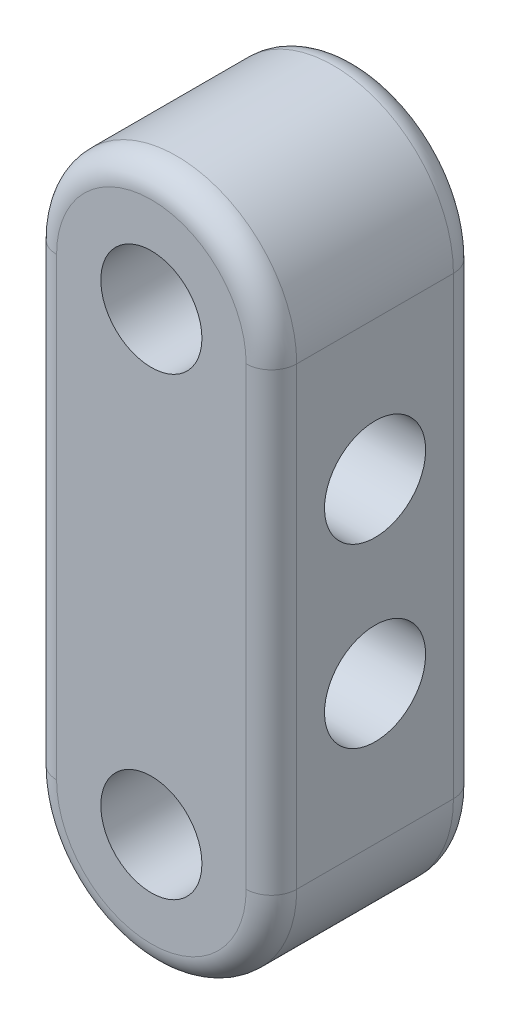
ISO-10303-21;
HEADER;
FILE_DESCRIPTION(('STEP AP214'),'2;1');
FILE_NAME('part.step','',(''),(''),'','','');
FILE_SCHEMA(('AUTOMOTIVE_DESIGN { 1 0 10303 214 1 1 1 1 }'));
ENDSEC;
DATA;
#1=APPLICATION_CONTEXT('core data for automotive mechanical design processes');
#2=APPLICATION_PROTOCOL_DEFINITION('international standard','automotive_design',2000,#1);
#3=PRODUCT_CONTEXT('',#1,'mechanical');
#4=PRODUCT('Part','Part','',(#3));
#5=PRODUCT_RELATED_PRODUCT_CATEGORY('part','',(#4));
#6=PRODUCT_DEFINITION_FORMATION('','',#4);
#7=PRODUCT_DEFINITION_CONTEXT('part definition',#1,'design');
#8=PRODUCT_DEFINITION('design','',#6,#7);
#9=PRODUCT_DEFINITION_SHAPE('','',#8);
#10=(LENGTH_UNIT() NAMED_UNIT(*) SI_UNIT(.MILLI.,.METRE.));
#11=(NAMED_UNIT(*) PLANE_ANGLE_UNIT() SI_UNIT($,.RADIAN.));
#12=(NAMED_UNIT(*) SI_UNIT($,.STERADIAN.) SOLID_ANGLE_UNIT());
#13=UNCERTAINTY_MEASURE_WITH_UNIT(LENGTH_MEASURE(1.E-05),#10,'distance_accuracy_value','');
#14=(GEOMETRIC_REPRESENTATION_CONTEXT(3) GLOBAL_UNCERTAINTY_ASSIGNED_CONTEXT((#13)) GLOBAL_UNIT_ASSIGNED_CONTEXT((#10,
#11,#12)) REPRESENTATION_CONTEXT('',''));
#15=CARTESIAN_POINT('',(0.,0.,0.));
#16=DIRECTION('',(0.,0.,1.));
#17=DIRECTION('',(1.,0.,0.));
#18=AXIS2_PLACEMENT_3D('',#15,#16,#17);
#19=CARTESIAN_POINT('',(4.75,0.,8.2));
#20=DIRECTION('',(0.,0.,-1.));
#21=DIRECTION('',(-1.,0.,0.));
#22=AXIS2_PLACEMENT_3D('',#19,#20,#21);
#23=CYLINDRICAL_SURFACE('',#22,4.75);
#24=DIRECTION('',(0.,0.,-1.));
#25=VECTOR('',#24,1.);
#26=CARTESIAN_POINT('',(0.,0.,8.2));
#27=LINE('',#26,#25);
#28=CARTESIAN_POINT('',(0.,0.,7.2));
#29=VERTEX_POINT('',#28);
#30=CARTESIAN_POINT('',(0.,0.,1.));
#31=VERTEX_POINT('',#30);
#32=EDGE_CURVE('E185',#29,#31,#27,.T.);
#33=ORIENTED_EDGE('',*,*,#32,.T.);
#34=CARTESIAN_POINT('',(4.75,0.,1.));
#35=DIRECTION('',(0.,0.,-1.));
#36=DIRECTION('',(-1.,0.,0.));
#37=AXIS2_PLACEMENT_3D('',#34,#35,#36);
#38=CIRCLE('',#37,4.75);
#39=CARTESIAN_POINT('',(9.50000000000001,0.,1.));
#40=VERTEX_POINT('',#39);
#41=EDGE_CURVE('E59',#31,#40,#38,.F.);
#42=ORIENTED_EDGE('',*,*,#41,.T.);
#43=DIRECTION('',(0.,0.,-1.));
#44=VECTOR('',#43,1.);
#45=CARTESIAN_POINT('',(9.50000000000001,0.,8.2));
#46=LINE('',#45,#44);
#47=CARTESIAN_POINT('',(9.50000000000001,0.,7.2));
#48=VERTEX_POINT('',#47);
#49=EDGE_CURVE('E126',#48,#40,#46,.T.);
#50=ORIENTED_EDGE('',*,*,#49,.F.);
#51=CARTESIAN_POINT('',(4.75,0.,7.2));
#52=DIRECTION('',(0.,0.,-1.));
#53=DIRECTION('',(-1.,0.,0.));
#54=AXIS2_PLACEMENT_3D('',#51,#52,#53);
#55=CIRCLE('',#54,4.75);
#56=EDGE_CURVE('E129',#48,#29,#55,.T.);
#57=ORIENTED_EDGE('',*,*,#56,.T.);
#58=EDGE_LOOP('',(#33,#42,#50,#57));
#59=FACE_BOUND('',#58,.T.);
#60=ADVANCED_FACE('F36',(#59),#23,.T.);
#61=CARTESIAN_POINT('',(9.5,18.,8.2));
#62=DIRECTION('',(-1.,0.,0.));
#63=DIRECTION('',(0.,-1.,0.));
#64=AXIS2_PLACEMENT_3D('',#61,#62,#63);
#65=PLANE('',#64);
#66=CARTESIAN_POINT('',(9.50000000000001,5.5,4.1));
#67=DIRECTION('',(1.,0.,0.));
#68=DIRECTION('',(0.,1.,0.));
#69=AXIS2_PLACEMENT_3D('',#66,#67,#68);
#70=CIRCLE('',#69,2.);
#71=CARTESIAN_POINT('',(9.50000000000001,7.5,4.1));
#72=VERTEX_POINT('',#71);
#73=EDGE_CURVE('E204',#72,#72,#70,.T.);
#74=ORIENTED_EDGE('',*,*,#73,.F.);
#75=EDGE_LOOP('',(#74));
#76=FACE_BOUND('',#75,.T.);
#77=CARTESIAN_POINT('',(9.50000000000001,12.5,4.1));
#78=DIRECTION('',(1.,0.,0.));
#79=DIRECTION('',(0.,1.,0.));
#80=AXIS2_PLACEMENT_3D('',#77,#78,#79);
#81=CIRCLE('',#80,2.);
#82=CARTESIAN_POINT('',(9.50000000000001,14.5,4.1));
#83=VERTEX_POINT('',#82);
#84=EDGE_CURVE('E198',#83,#83,#81,.T.);
#85=ORIENTED_EDGE('',*,*,#84,.F.);
#86=EDGE_LOOP('',(#85));
#87=FACE_BOUND('',#86,.T.);
#88=ORIENTED_EDGE('',*,*,#49,.T.);
#89=DIRECTION('',(0.,1.,0.));
#90=VECTOR('',#89,1.);
#91=CARTESIAN_POINT('',(9.5,18.,1.));
#92=LINE('',#91,#90);
#93=CARTESIAN_POINT('',(9.5,18.,1.));
#94=VERTEX_POINT('',#93);
#95=EDGE_CURVE('E11',#40,#94,#92,.T.);
#96=ORIENTED_EDGE('',*,*,#95,.T.);
#97=DIRECTION('',(0.,0.,-1.));
#98=VECTOR('',#97,1.);
#99=CARTESIAN_POINT('',(9.5,18.,8.2));
#100=LINE('',#99,#98);
#101=CARTESIAN_POINT('',(9.5,18.,7.2));
#102=VERTEX_POINT('',#101);
#103=EDGE_CURVE('E180',#102,#94,#100,.T.);
#104=ORIENTED_EDGE('',*,*,#103,.F.);
#105=DIRECTION('',(0.,1.,0.));
#106=VECTOR('',#105,1.);
#107=CARTESIAN_POINT('',(9.5,18.,7.2));
#108=LINE('',#107,#106);
#109=EDGE_CURVE('E142',#102,#48,#108,.F.);
#110=ORIENTED_EDGE('',*,*,#109,.T.);
#111=EDGE_LOOP('',(#88,#96,#104,#110));
#112=FACE_BOUND('',#111,.T.);
#113=ADVANCED_FACE('F220',(#76,#87,#112),#65,.F.);
#114=CARTESIAN_POINT('',(4.75,18.,8.2));
#115=DIRECTION('',(0.,0.,-1.));
#116=DIRECTION('',(-1.,0.,0.));
#117=AXIS2_PLACEMENT_3D('',#114,#115,#116);
#118=CYLINDRICAL_SURFACE('',#117,4.75);
#119=ORIENTED_EDGE('',*,*,#103,.T.);
#120=CARTESIAN_POINT('',(4.75,18.,1.));
#121=DIRECTION('',(0.,0.,-1.));
#122=DIRECTION('',(-1.,0.,0.));
#123=AXIS2_PLACEMENT_3D('',#120,#121,#122);
#124=CIRCLE('',#123,4.75);
#125=CARTESIAN_POINT('',(0.,18.,1.));
#126=VERTEX_POINT('',#125);
#127=EDGE_CURVE('E45',#94,#126,#124,.F.);
#128=ORIENTED_EDGE('',*,*,#127,.T.);
#129=DIRECTION('',(0.,0.,-1.));
#130=VECTOR('',#129,1.);
#131=CARTESIAN_POINT('',(0.,18.,8.2));
#132=LINE('',#131,#130);
#133=CARTESIAN_POINT('',(0.,18.,7.2));
#134=VERTEX_POINT('',#133);
#135=EDGE_CURVE('E182',#134,#126,#132,.T.);
#136=ORIENTED_EDGE('',*,*,#135,.F.);
#137=CARTESIAN_POINT('',(4.75,18.,7.2));
#138=DIRECTION('',(0.,0.,-1.));
#139=DIRECTION('',(-1.,0.,0.));
#140=AXIS2_PLACEMENT_3D('',#137,#138,#139);
#141=CIRCLE('',#140,4.75);
#142=EDGE_CURVE('E171',#134,#102,#141,.T.);
#143=ORIENTED_EDGE('',*,*,#142,.T.);
#144=EDGE_LOOP('',(#119,#128,#136,#143));
#145=FACE_BOUND('',#144,.T.);
#146=ADVANCED_FACE('F223',(#145),#118,.T.);
#147=CARTESIAN_POINT('',(0.,0.,8.2));
#148=DIRECTION('',(1.,0.,0.));
#149=DIRECTION('',(0.,0.,-1.));
#150=AXIS2_PLACEMENT_3D('',#147,#148,#149);
#151=PLANE('',#150);
#152=CARTESIAN_POINT('',(0.,5.5,4.1));
#153=DIRECTION('',(1.,0.,0.));
#154=DIRECTION('',(0.,1.,0.));
#155=AXIS2_PLACEMENT_3D('',#152,#153,#154);
#156=CIRCLE('',#155,2.);
#157=CARTESIAN_POINT('',(0.,7.5,4.1));
#158=VERTEX_POINT('',#157);
#159=EDGE_CURVE('E201',#158,#158,#156,.T.);
#160=ORIENTED_EDGE('',*,*,#159,.T.);
#161=EDGE_LOOP('',(#160));
#162=FACE_BOUND('',#161,.T.);
#163=CARTESIAN_POINT('',(0.,12.5,4.1));
#164=DIRECTION('',(1.,0.,0.));
#165=DIRECTION('',(0.,1.,0.));
#166=AXIS2_PLACEMENT_3D('',#163,#164,#165);
#167=CIRCLE('',#166,2.);
#168=CARTESIAN_POINT('',(0.,14.5,4.1));
#169=VERTEX_POINT('',#168);
#170=EDGE_CURVE('E156',#169,#169,#167,.T.);
#171=ORIENTED_EDGE('',*,*,#170,.T.);
#172=EDGE_LOOP('',(#171));
#173=FACE_BOUND('',#172,.T.);
#174=ORIENTED_EDGE('',*,*,#135,.T.);
#175=DIRECTION('',(0.,-1.,0.));
#176=VECTOR('',#175,1.);
#177=CARTESIAN_POINT('',(0.,0.,1.));
#178=LINE('',#177,#176);
#179=EDGE_CURVE('E138',#126,#31,#178,.T.);
#180=ORIENTED_EDGE('',*,*,#179,.T.);
#181=ORIENTED_EDGE('',*,*,#32,.F.);
#182=DIRECTION('',(0.,-1.,0.));
#183=VECTOR('',#182,1.);
#184=CARTESIAN_POINT('',(0.,0.,7.2));
#185=LINE('',#184,#183);
#186=EDGE_CURVE('E174',#29,#134,#185,.F.);
#187=ORIENTED_EDGE('',*,*,#186,.T.);
#188=EDGE_LOOP('',(#174,#180,#181,#187));
#189=FACE_BOUND('',#188,.T.);
#190=ADVANCED_FACE('F210',(#162,#173,#189),#151,.F.);
#191=CARTESIAN_POINT('',(4.75,0.,8.2));
#192=DIRECTION('',(0.,0.,-1.));
#193=DIRECTION('',(-1.,0.,0.));
#194=AXIS2_PLACEMENT_3D('',#191,#192,#193);
#195=PLANE('',#194);
#196=CARTESIAN_POINT('',(4.75,18.,8.2));
#197=DIRECTION('',(0.,0.,-1.));
#198=DIRECTION('',(-1.,0.,0.));
#199=AXIS2_PLACEMENT_3D('',#196,#197,#198);
#200=CIRCLE('',#199,3.75);
#201=CARTESIAN_POINT('',(8.5,18.,8.2));
#202=VERTEX_POINT('',#201);
#203=CARTESIAN_POINT('',(1.,18.,8.2));
#204=VERTEX_POINT('',#203);
#205=EDGE_CURVE('E115',#202,#204,#200,.F.);
#206=ORIENTED_EDGE('',*,*,#205,.T.);
#207=DIRECTION('',(0.,-1.,0.));
#208=VECTOR('',#207,1.);
#209=CARTESIAN_POINT('',(1.,0.,8.2));
#210=LINE('',#209,#208);
#211=CARTESIAN_POINT('',(1.,0.,8.2));
#212=VERTEX_POINT('',#211);
#213=EDGE_CURVE('E111',#204,#212,#210,.T.);
#214=ORIENTED_EDGE('',*,*,#213,.T.);
#215=CARTESIAN_POINT('',(4.75,0.,8.2));
#216=DIRECTION('',(0.,0.,-1.));
#217=DIRECTION('',(-1.,0.,0.));
#218=AXIS2_PLACEMENT_3D('',#215,#216,#217);
#219=CIRCLE('',#218,3.75);
#220=CARTESIAN_POINT('',(8.50000000000001,0.,8.2));
#221=VERTEX_POINT('',#220);
#222=EDGE_CURVE('E104',#212,#221,#219,.F.);
#223=ORIENTED_EDGE('',*,*,#222,.T.);
#224=DIRECTION('',(0.,1.,0.));
#225=VECTOR('',#224,1.);
#226=CARTESIAN_POINT('',(8.50000000000001,0.,8.2));
#227=LINE('',#226,#225);
#228=EDGE_CURVE('E108',#221,#202,#227,.T.);
#229=ORIENTED_EDGE('',*,*,#228,.T.);
#230=EDGE_LOOP('',(#206,#214,#223,#229));
#231=FACE_BOUND('',#230,.T.);
#232=CARTESIAN_POINT('',(4.75,0.,8.2));
#233=DIRECTION('',(0.,0.,1.));
#234=DIRECTION('',(1.,0.,0.));
#235=AXIS2_PLACEMENT_3D('',#232,#233,#234);
#236=CIRCLE('',#235,2.);
#237=CARTESIAN_POINT('',(6.75,0.,8.2));
#238=VERTEX_POINT('',#237);
#239=EDGE_CURVE('E132',#238,#238,#236,.T.);
#240=ORIENTED_EDGE('',*,*,#239,.F.);
#241=EDGE_LOOP('',(#240));
#242=FACE_BOUND('',#241,.T.);
#243=CARTESIAN_POINT('',(4.75,18.,8.2));
#244=DIRECTION('',(0.,0.,1.));
#245=DIRECTION('',(1.,0.,0.));
#246=AXIS2_PLACEMENT_3D('',#243,#244,#245);
#247=CIRCLE('',#246,2.);
#248=CARTESIAN_POINT('',(6.75,18.,8.2));
#249=VERTEX_POINT('',#248);
#250=EDGE_CURVE('E188',#249,#249,#247,.T.);
#251=ORIENTED_EDGE('',*,*,#250,.F.);
#252=EDGE_LOOP('',(#251));
#253=FACE_BOUND('',#252,.T.);
#254=ADVANCED_FACE('F106',(#231,#242,#253),#195,.F.);
#255=CARTESIAN_POINT('',(4.75,0.,0.));
#256=DIRECTION('',(0.,0.,-1.));
#257=DIRECTION('',(-1.,0.,0.));
#258=AXIS2_PLACEMENT_3D('',#255,#256,#257);
#259=PLANE('',#258);
#260=CARTESIAN_POINT('',(4.75,0.,0.));
#261=DIRECTION('',(0.,0.,-1.));
#262=DIRECTION('',(-1.,0.,0.));
#263=AXIS2_PLACEMENT_3D('',#260,#261,#262);
#264=CIRCLE('',#263,3.75);
#265=CARTESIAN_POINT('',(8.50000000000001,0.,0.));
#266=VERTEX_POINT('',#265);
#267=CARTESIAN_POINT('',(1.,0.,0.));
#268=VERTEX_POINT('',#267);
#269=EDGE_CURVE('E146',#266,#268,#264,.T.);
#270=ORIENTED_EDGE('',*,*,#269,.T.);
#271=DIRECTION('',(0.,-1.,0.));
#272=VECTOR('',#271,1.);
#273=CARTESIAN_POINT('',(1.,18.,0.));
#274=LINE('',#273,#272);
#275=CARTESIAN_POINT('',(1.,18.,0.));
#276=VERTEX_POINT('',#275);
#277=EDGE_CURVE('E148',#268,#276,#274,.F.);
#278=ORIENTED_EDGE('',*,*,#277,.T.);
#279=CARTESIAN_POINT('',(4.75,18.,0.));
#280=DIRECTION('',(0.,0.,-1.));
#281=DIRECTION('',(-1.,0.,0.));
#282=AXIS2_PLACEMENT_3D('',#279,#280,#281);
#283=CIRCLE('',#282,3.75);
#284=CARTESIAN_POINT('',(8.5,18.,0.));
#285=VERTEX_POINT('',#284);
#286=EDGE_CURVE('E144',#276,#285,#283,.T.);
#287=ORIENTED_EDGE('',*,*,#286,.T.);
#288=DIRECTION('',(0.,1.,0.));
#289=VECTOR('',#288,1.);
#290=CARTESIAN_POINT('',(8.50000000000001,0.,0.));
#291=LINE('',#290,#289);
#292=EDGE_CURVE('E141',#285,#266,#291,.F.);
#293=ORIENTED_EDGE('',*,*,#292,.T.);
#294=EDGE_LOOP('',(#270,#278,#287,#293));
#295=FACE_BOUND('',#294,.T.);
#296=CARTESIAN_POINT('',(4.75,0.,0.));
#297=DIRECTION('',(0.,0.,1.));
#298=DIRECTION('',(1.,0.,0.));
#299=AXIS2_PLACEMENT_3D('',#296,#297,#298);
#300=CIRCLE('',#299,2.);
#301=CARTESIAN_POINT('',(6.75,0.,0.));
#302=VERTEX_POINT('',#301);
#303=EDGE_CURVE('E191',#302,#302,#300,.T.);
#304=ORIENTED_EDGE('',*,*,#303,.T.);
#305=EDGE_LOOP('',(#304));
#306=FACE_BOUND('',#305,.T.);
#307=CARTESIAN_POINT('',(4.75,18.,0.));
#308=DIRECTION('',(0.,0.,1.));
#309=DIRECTION('',(1.,0.,0.));
#310=AXIS2_PLACEMENT_3D('',#307,#308,#309);
#311=CIRCLE('',#310,2.);
#312=CARTESIAN_POINT('',(6.75,18.,0.));
#313=VERTEX_POINT('',#312);
#314=EDGE_CURVE('E187',#313,#313,#311,.T.);
#315=ORIENTED_EDGE('',*,*,#314,.T.);
#316=EDGE_LOOP('',(#315));
#317=FACE_BOUND('',#316,.T.);
#318=ADVANCED_FACE('F279',(#295,#306,#317),#259,.T.);
#319=CARTESIAN_POINT('',(4.75,18.,0.));
#320=DIRECTION('',(0.,0.,1.));
#321=DIRECTION('',(1.,0.,0.));
#322=AXIS2_PLACEMENT_3D('',#319,#320,#321);
#323=CYLINDRICAL_SURFACE('',#322,2.);
#324=ORIENTED_EDGE('',*,*,#314,.F.);
#325=EDGE_LOOP('',(#324));
#326=FACE_BOUND('',#325,.T.);
#327=ORIENTED_EDGE('',*,*,#250,.T.);
#328=EDGE_LOOP('',(#327));
#329=FACE_BOUND('',#328,.T.);
#330=ADVANCED_FACE('F282',(#326,#329),#323,.F.);
#331=CARTESIAN_POINT('',(4.75,0.,0.));
#332=DIRECTION('',(0.,0.,1.));
#333=DIRECTION('',(1.,0.,0.));
#334=AXIS2_PLACEMENT_3D('',#331,#332,#333);
#335=CYLINDRICAL_SURFACE('',#334,2.);
#336=ORIENTED_EDGE('',*,*,#303,.F.);
#337=EDGE_LOOP('',(#336));
#338=FACE_BOUND('',#337,.T.);
#339=ORIENTED_EDGE('',*,*,#239,.T.);
#340=EDGE_LOOP('',(#339));
#341=FACE_BOUND('',#340,.T.);
#342=ADVANCED_FACE('F247',(#338,#341),#335,.F.);
#343=CARTESIAN_POINT('',(8.50000000000001,0.,7.2));
#344=DIRECTION('',(0.,1.,0.));
#345=DIRECTION('',(-1.,0.,0.));
#346=AXIS2_PLACEMENT_3D('',#343,#344,#345);
#347=CYLINDRICAL_SURFACE('',#346,1.);
#348=CARTESIAN_POINT('',(8.5,0.,7.2));
#349=DIRECTION('',(0.,-1.,0.));
#350=DIRECTION('',(1.,0.,0.));
#351=AXIS2_PLACEMENT_3D('',#348,#349,#350);
#352=CIRCLE('',#351,1.);
#353=EDGE_CURVE('E121',#48,#221,#352,.T.);
#354=ORIENTED_EDGE('',*,*,#353,.F.);
#355=ORIENTED_EDGE('',*,*,#109,.F.);
#356=CARTESIAN_POINT('',(8.5,18.,7.2));
#357=DIRECTION('',(0.,1.,0.));
#358=DIRECTION('',(0.,0.,1.));
#359=AXIS2_PLACEMENT_3D('',#356,#357,#358);
#360=CIRCLE('',#359,1.);
#361=EDGE_CURVE('E124',#202,#102,#360,.T.);
#362=ORIENTED_EDGE('',*,*,#361,.F.);
#363=ORIENTED_EDGE('',*,*,#228,.F.);
#364=EDGE_LOOP('',(#354,#355,#362,#363));
#365=FACE_BOUND('',#364,.T.);
#366=ADVANCED_FACE('F119',(#365),#347,.T.);
#367=CARTESIAN_POINT('',(4.75,18.,7.2));
#368=DIRECTION('',(0.,0.,-1.));
#369=DIRECTION('',(-1.,0.,0.));
#370=AXIS2_PLACEMENT_3D('',#367,#368,#369);
#371=TOROIDAL_SURFACE('',#370,3.75,1.);
#372=ORIENTED_EDGE('',*,*,#361,.T.);
#373=ORIENTED_EDGE('',*,*,#142,.F.);
#374=CARTESIAN_POINT('',(1.,18.,7.2));
#375=DIRECTION('',(0.,-1.,0.));
#376=DIRECTION('',(0.,0.,-1.));
#377=AXIS2_PLACEMENT_3D('',#374,#375,#376);
#378=CIRCLE('',#377,1.);
#379=EDGE_CURVE('E130',#204,#134,#378,.T.);
#380=ORIENTED_EDGE('',*,*,#379,.F.);
#381=ORIENTED_EDGE('',*,*,#205,.F.);
#382=EDGE_LOOP('',(#372,#373,#380,#381));
#383=FACE_BOUND('',#382,.T.);
#384=ADVANCED_FACE('F239',(#383),#371,.T.);
#385=CARTESIAN_POINT('',(4.75,0.,7.2));
#386=DIRECTION('',(0.,0.,-1.));
#387=DIRECTION('',(-1.,0.,0.));
#388=AXIS2_PLACEMENT_3D('',#385,#386,#387);
#389=TOROIDAL_SURFACE('',#388,3.75,1.);
#390=ORIENTED_EDGE('',*,*,#353,.T.);
#391=ORIENTED_EDGE('',*,*,#222,.F.);
#392=CARTESIAN_POINT('',(1.,0.,7.2));
#393=DIRECTION('',(0.,1.,0.));
#394=DIRECTION('',(0.,0.,1.));
#395=AXIS2_PLACEMENT_3D('',#392,#393,#394);
#396=CIRCLE('',#395,1.);
#397=EDGE_CURVE('E134',#29,#212,#396,.T.);
#398=ORIENTED_EDGE('',*,*,#397,.F.);
#399=ORIENTED_EDGE('',*,*,#56,.F.);
#400=EDGE_LOOP('',(#390,#391,#398,#399));
#401=FACE_BOUND('',#400,.T.);
#402=ADVANCED_FACE('F128',(#401),#389,.T.);
#403=CARTESIAN_POINT('',(1.,0.,7.2));
#404=DIRECTION('',(0.,-1.,0.));
#405=DIRECTION('',(0.,0.,-1.));
#406=AXIS2_PLACEMENT_3D('',#403,#404,#405);
#407=CYLINDRICAL_SURFACE('',#406,1.);
#408=ORIENTED_EDGE('',*,*,#379,.T.);
#409=ORIENTED_EDGE('',*,*,#186,.F.);
#410=ORIENTED_EDGE('',*,*,#397,.T.);
#411=ORIENTED_EDGE('',*,*,#213,.F.);
#412=EDGE_LOOP('',(#408,#409,#410,#411));
#413=FACE_BOUND('',#412,.T.);
#414=ADVANCED_FACE('F235',(#413),#407,.T.);
#415=CARTESIAN_POINT('',(8.5,18.,1.));
#416=DIRECTION('',(0.,-1.,0.));
#417=DIRECTION('',(1.,0.,0.));
#418=AXIS2_PLACEMENT_3D('',#415,#416,#417);
#419=CYLINDRICAL_SURFACE('',#418,1.);
#420=CARTESIAN_POINT('',(8.50000000000001,0.,1.));
#421=DIRECTION('',(0.,-1.,0.));
#422=DIRECTION('',(1.,0.,0.));
#423=AXIS2_PLACEMENT_3D('',#420,#421,#422);
#424=CIRCLE('',#423,1.);
#425=EDGE_CURVE('E157',#266,#40,#424,.T.);
#426=ORIENTED_EDGE('',*,*,#425,.F.);
#427=ORIENTED_EDGE('',*,*,#292,.F.);
#428=CARTESIAN_POINT('',(8.5,18.,1.));
#429=DIRECTION('',(0.,1.,0.));
#430=DIRECTION('',(0.,0.,1.));
#431=AXIS2_PLACEMENT_3D('',#428,#429,#430);
#432=CIRCLE('',#431,1.);
#433=EDGE_CURVE('E40',#94,#285,#432,.T.);
#434=ORIENTED_EDGE('',*,*,#433,.F.);
#435=ORIENTED_EDGE('',*,*,#95,.F.);
#436=EDGE_LOOP('',(#426,#427,#434,#435));
#437=FACE_BOUND('',#436,.T.);
#438=ADVANCED_FACE('F38',(#437),#419,.T.);
#439=CARTESIAN_POINT('',(4.75,18.,1.));
#440=DIRECTION('',(0.,0.,-1.));
#441=DIRECTION('',(-1.,0.,0.));
#442=AXIS2_PLACEMENT_3D('',#439,#440,#441);
#443=TOROIDAL_SURFACE('',#442,3.75,1.);
#444=ORIENTED_EDGE('',*,*,#433,.T.);
#445=ORIENTED_EDGE('',*,*,#286,.F.);
#446=CARTESIAN_POINT('',(1.,18.,1.));
#447=DIRECTION('',(0.,-1.,0.));
#448=DIRECTION('',(0.,0.,-1.));
#449=AXIS2_PLACEMENT_3D('',#446,#447,#448);
#450=CIRCLE('',#449,1.);
#451=EDGE_CURVE('E155',#126,#276,#450,.T.);
#452=ORIENTED_EDGE('',*,*,#451,.F.);
#453=ORIENTED_EDGE('',*,*,#127,.F.);
#454=EDGE_LOOP('',(#444,#445,#452,#453));
#455=FACE_BOUND('',#454,.T.);
#456=ADVANCED_FACE('F229',(#455),#443,.T.);
#457=CARTESIAN_POINT('',(4.75,0.,1.));
#458=DIRECTION('',(0.,0.,-1.));
#459=DIRECTION('',(-1.,0.,0.));
#460=AXIS2_PLACEMENT_3D('',#457,#458,#459);
#461=TOROIDAL_SURFACE('',#460,3.75,1.);
#462=ORIENTED_EDGE('',*,*,#425,.T.);
#463=ORIENTED_EDGE('',*,*,#41,.F.);
#464=CARTESIAN_POINT('',(1.,0.,1.));
#465=DIRECTION('',(0.,1.,0.));
#466=DIRECTION('',(0.,0.,1.));
#467=AXIS2_PLACEMENT_3D('',#464,#465,#466);
#468=CIRCLE('',#467,1.);
#469=EDGE_CURVE('E153',#268,#31,#468,.T.);
#470=ORIENTED_EDGE('',*,*,#469,.F.);
#471=ORIENTED_EDGE('',*,*,#269,.F.);
#472=EDGE_LOOP('',(#462,#463,#470,#471));
#473=FACE_BOUND('',#472,.T.);
#474=ADVANCED_FACE('F262',(#473),#461,.T.);
#475=CARTESIAN_POINT('',(1.,0.,1.));
#476=DIRECTION('',(0.,1.,0.));
#477=DIRECTION('',(0.,0.,1.));
#478=AXIS2_PLACEMENT_3D('',#475,#476,#477);
#479=CYLINDRICAL_SURFACE('',#478,1.);
#480=ORIENTED_EDGE('',*,*,#451,.T.);
#481=ORIENTED_EDGE('',*,*,#277,.F.);
#482=ORIENTED_EDGE('',*,*,#469,.T.);
#483=ORIENTED_EDGE('',*,*,#179,.F.);
#484=EDGE_LOOP('',(#480,#481,#482,#483));
#485=FACE_BOUND('',#484,.T.);
#486=ADVANCED_FACE('F266',(#485),#479,.T.);
#487=CARTESIAN_POINT('',(0.,12.5,4.1));
#488=DIRECTION('',(1.,0.,0.));
#489=DIRECTION('',(0.,1.,0.));
#490=AXIS2_PLACEMENT_3D('',#487,#488,#489);
#491=CYLINDRICAL_SURFACE('',#490,2.);
#492=ORIENTED_EDGE('',*,*,#170,.F.);
#493=EDGE_LOOP('',(#492));
#494=FACE_BOUND('',#493,.T.);
#495=ORIENTED_EDGE('',*,*,#84,.T.);
#496=EDGE_LOOP('',(#495));
#497=FACE_BOUND('',#496,.T.);
#498=ADVANCED_FACE('F216',(#494,#497),#491,.F.);
#499=CARTESIAN_POINT('',(0.,5.5,4.1));
#500=DIRECTION('',(1.,0.,0.));
#501=DIRECTION('',(0.,1.,0.));
#502=AXIS2_PLACEMENT_3D('',#499,#500,#501);
#503=CYLINDRICAL_SURFACE('',#502,2.);
#504=ORIENTED_EDGE('',*,*,#159,.F.);
#505=EDGE_LOOP('',(#504));
#506=FACE_BOUND('',#505,.T.);
#507=ORIENTED_EDGE('',*,*,#73,.T.);
#508=EDGE_LOOP('',(#507));
#509=FACE_BOUND('',#508,.T.);
#510=ADVANCED_FACE('F213',(#506,#509),#503,.F.);
#511=CLOSED_SHELL('',(#60,#113,#146,#190,#254,#318,#330,#342,#366,#384,#402,#414,#438,#456,#474,
#486,#498,#510));
#512=MANIFOLD_SOLID_BREP('B2',#511);
#513=ADVANCED_BREP_SHAPE_REPRESENTATION('',(#18,#512),#14);
#514=SHAPE_DEFINITION_REPRESENTATION(#9,#513);
ENDSEC;
END-ISO-10303-21;
